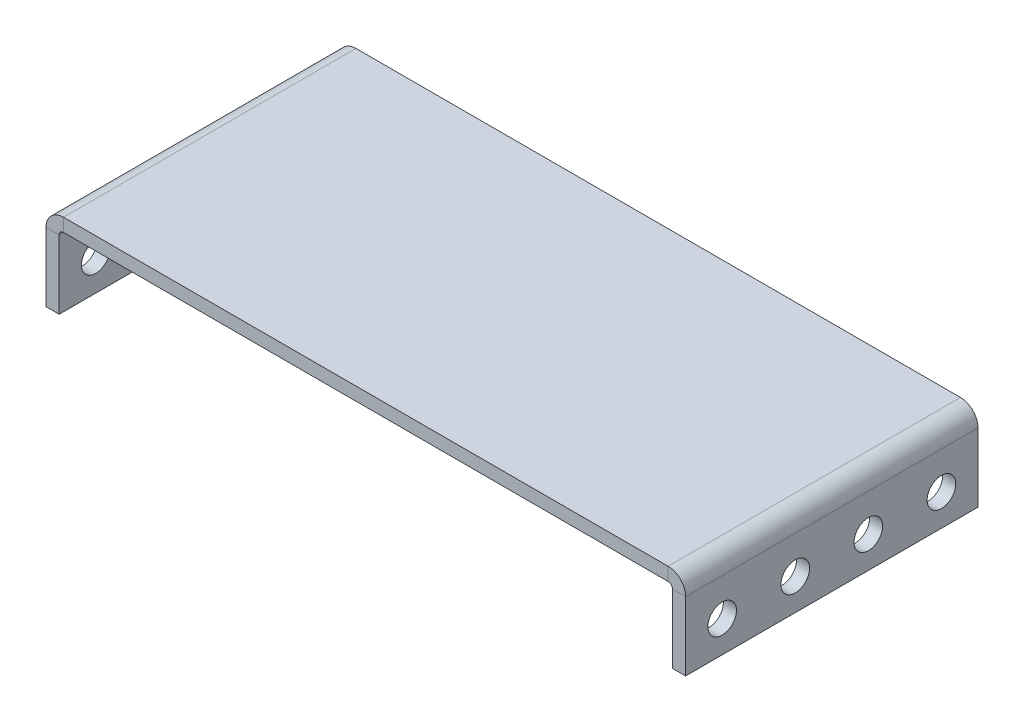
ISO-10303-21;
HEADER;
FILE_DESCRIPTION(('STEP AP214'),'2;1');
FILE_NAME('part.step','',(''),(''),'','','');
FILE_SCHEMA(('AUTOMOTIVE_DESIGN { 1 0 10303 214 1 1 1 1 }'));
ENDSEC;
DATA;
#1=APPLICATION_CONTEXT('core data for automotive mechanical design processes');
#2=APPLICATION_PROTOCOL_DEFINITION('international standard','automotive_design',2000,#1);
#3=PRODUCT_CONTEXT('',#1,'mechanical');
#4=PRODUCT('Part','Part','',(#3));
#5=PRODUCT_RELATED_PRODUCT_CATEGORY('part','',(#4));
#6=PRODUCT_DEFINITION_FORMATION('','',#4);
#7=PRODUCT_DEFINITION_CONTEXT('part definition',#1,'design');
#8=PRODUCT_DEFINITION('design','',#6,#7);
#9=PRODUCT_DEFINITION_SHAPE('','',#8);
#10=(LENGTH_UNIT() NAMED_UNIT(*) SI_UNIT(.MILLI.,.METRE.));
#11=(NAMED_UNIT(*) PLANE_ANGLE_UNIT() SI_UNIT($,.RADIAN.));
#12=(NAMED_UNIT(*) SI_UNIT($,.STERADIAN.) SOLID_ANGLE_UNIT());
#13=UNCERTAINTY_MEASURE_WITH_UNIT(LENGTH_MEASURE(1.E-05),#10,'distance_accuracy_value','');
#14=(GEOMETRIC_REPRESENTATION_CONTEXT(3) GLOBAL_UNCERTAINTY_ASSIGNED_CONTEXT((#13)) GLOBAL_UNIT_ASSIGNED_CONTEXT((#10,
#11,#12)) REPRESENTATION_CONTEXT('',''));
#15=CARTESIAN_POINT('',(0.,0.,0.));
#16=DIRECTION('',(0.,0.,1.));
#17=DIRECTION('',(1.,0.,0.));
#18=AXIS2_PLACEMENT_3D('',#15,#16,#17);
#19=CARTESIAN_POINT('',(52.5145,6.34999999999999,50.8));
#20=DIRECTION('',(0.,0.,1.));
#21=DIRECTION('',(1.,0.,0.));
#22=AXIS2_PLACEMENT_3D('',#19,#20,#21);
#23=PLANE('',#22);
#24=DIRECTION('',(0.,1.,0.));
#25=VECTOR('',#24,1.);
#26=CARTESIAN_POINT('',(52.5145,6.34999999999999,50.8));
#27=LINE('',#26,#25);
#28=CARTESIAN_POINT('',(52.5145,6.34999999999999,50.8));
#29=VERTEX_POINT('',#28);
#30=CARTESIAN_POINT('',(52.5145,8.63599999999999,50.8));
#31=VERTEX_POINT('',#30);
#32=EDGE_CURVE('E11',#29,#31,#27,.T.);
#33=ORIENTED_EDGE('',*,*,#32,.F.);
#34=CARTESIAN_POINT('',(52.5145,5.58799999999999,50.8));
#35=DIRECTION('',(0.,0.,-1.));
#36=DIRECTION('',(-1.,0.,0.));
#37=AXIS2_PLACEMENT_3D('',#34,#35,#36);
#38=CIRCLE('',#37,0.762);
#39=CARTESIAN_POINT('',(53.2765,5.58799999999999,50.8));
#40=VERTEX_POINT('',#39);
#41=EDGE_CURVE('E290',#40,#29,#38,.F.);
#42=ORIENTED_EDGE('',*,*,#41,.F.);
#43=DIRECTION('',(-1.,0.,0.));
#44=VECTOR('',#43,1.);
#45=CARTESIAN_POINT('',(55.5625,5.58799999999999,50.8));
#46=LINE('',#45,#44);
#47=CARTESIAN_POINT('',(55.5625,5.58799999999999,50.8));
#48=VERTEX_POINT('',#47);
#49=EDGE_CURVE('E53',#48,#40,#46,.T.);
#50=ORIENTED_EDGE('',*,*,#49,.F.);
#51=CARTESIAN_POINT('',(52.5145,5.58799999999999,50.8));
#52=DIRECTION('',(0.,0.,1.));
#53=DIRECTION('',(1.,0.,0.));
#54=AXIS2_PLACEMENT_3D('',#51,#52,#53);
#55=CIRCLE('',#54,3.048);
#56=EDGE_CURVE('E154',#48,#31,#55,.T.);
#57=ORIENTED_EDGE('',*,*,#56,.T.);
#58=EDGE_LOOP('',(#33,#42,#50,#57));
#59=FACE_BOUND('',#58,.T.);
#60=ADVANCED_FACE('F44',(#59),#23,.T.);
#61=CARTESIAN_POINT('',(55.5625,5.58799999999999,50.8));
#62=DIRECTION('',(0.,0.,1.));
#63=DIRECTION('',(1.,0.,0.));
#64=AXIS2_PLACEMENT_3D('',#61,#62,#63);
#65=PLANE('',#64);
#66=DIRECTION('',(-1.,0.,0.));
#67=VECTOR('',#66,1.);
#68=CARTESIAN_POINT('',(-53.2765,6.35,50.8));
#69=LINE('',#68,#67);
#70=CARTESIAN_POINT('',(-52.5145,6.35,50.8));
#71=VERTEX_POINT('',#70);
#72=EDGE_CURVE('E148',#29,#71,#69,.T.);
#73=ORIENTED_EDGE('',*,*,#72,.F.);
#74=ORIENTED_EDGE('',*,*,#32,.T.);
#75=DIRECTION('',(-1.,0.,0.));
#76=VECTOR('',#75,1.);
#77=CARTESIAN_POINT('',(-53.2765,8.636,50.8));
#78=LINE('',#77,#76);
#79=CARTESIAN_POINT('',(-52.5145,8.636,50.8));
#80=VERTEX_POINT('',#79);
#81=EDGE_CURVE('E145',#31,#80,#78,.T.);
#82=ORIENTED_EDGE('',*,*,#81,.T.);
#83=DIRECTION('',(0.,-1.,0.));
#84=VECTOR('',#83,1.);
#85=CARTESIAN_POINT('',(-52.5145,8.636,50.8));
#86=LINE('',#85,#84);
#87=EDGE_CURVE('E266',#80,#71,#86,.T.);
#88=ORIENTED_EDGE('',*,*,#87,.T.);
#89=EDGE_LOOP('',(#73,#74,#82,#88));
#90=FACE_BOUND('',#89,.T.);
#91=ADVANCED_FACE('F143',(#90),#65,.T.);
#92=CARTESIAN_POINT('',(53.2765,5.58799999999999,0.));
#93=DIRECTION('',(0.,0.,-1.));
#94=DIRECTION('',(-1.,0.,0.));
#95=AXIS2_PLACEMENT_3D('',#92,#93,#94);
#96=PLANE('',#95);
#97=DIRECTION('',(1.,0.,0.));
#98=VECTOR('',#97,1.);
#99=CARTESIAN_POINT('',(53.2765,5.58799999999999,0.));
#100=LINE('',#99,#98);
#101=CARTESIAN_POINT('',(53.2765,5.58799999999999,0.));
#102=VERTEX_POINT('',#101);
#103=CARTESIAN_POINT('',(55.5625,5.58799999999999,0.));
#104=VERTEX_POINT('',#103);
#105=EDGE_CURVE('E274',#102,#104,#100,.T.);
#106=ORIENTED_EDGE('',*,*,#105,.F.);
#107=CARTESIAN_POINT('',(52.5145,5.58799999999999,0.));
#108=DIRECTION('',(0.,0.,-1.));
#109=DIRECTION('',(-1.,0.,0.));
#110=AXIS2_PLACEMENT_3D('',#107,#108,#109);
#111=CIRCLE('',#110,0.762);
#112=CARTESIAN_POINT('',(52.5145,6.34999999999999,0.));
#113=VERTEX_POINT('',#112);
#114=EDGE_CURVE('E203',#102,#113,#111,.F.);
#115=ORIENTED_EDGE('',*,*,#114,.T.);
#116=DIRECTION('',(0.,-1.,0.));
#117=VECTOR('',#116,1.);
#118=CARTESIAN_POINT('',(52.5145,8.63599999999999,0.));
#119=LINE('',#118,#117);
#120=CARTESIAN_POINT('',(52.5145,8.63599999999999,0.));
#121=VERTEX_POINT('',#120);
#122=EDGE_CURVE('E271',#121,#113,#119,.T.);
#123=ORIENTED_EDGE('',*,*,#122,.F.);
#124=CARTESIAN_POINT('',(52.5145,5.58799999999999,0.));
#125=DIRECTION('',(0.,0.,1.));
#126=DIRECTION('',(1.,0.,0.));
#127=AXIS2_PLACEMENT_3D('',#124,#125,#126);
#128=CIRCLE('',#127,3.048);
#129=EDGE_CURVE('E167',#104,#121,#128,.T.);
#130=ORIENTED_EDGE('',*,*,#129,.F.);
#131=EDGE_LOOP('',(#106,#115,#123,#130));
#132=FACE_BOUND('',#131,.T.);
#133=ADVANCED_FACE('F400',(#132),#96,.T.);
#134=CARTESIAN_POINT('',(52.5145,8.63599999999999,0.));
#135=DIRECTION('',(0.,0.,-1.));
#136=DIRECTION('',(-1.,0.,0.));
#137=AXIS2_PLACEMENT_3D('',#134,#135,#136);
#138=PLANE('',#137);
#139=DIRECTION('',(0.,1.,0.));
#140=VECTOR('',#139,1.);
#141=CARTESIAN_POINT('',(53.2765,6.34999999999999,0.));
#142=LINE('',#141,#140);
#143=CARTESIAN_POINT('',(53.2765,-6.34999999999999,0.));
#144=VERTEX_POINT('',#143);
#145=EDGE_CURVE('E207',#144,#102,#142,.T.);
#146=ORIENTED_EDGE('',*,*,#145,.T.);
#147=ORIENTED_EDGE('',*,*,#105,.T.);
#148=DIRECTION('',(0.,1.,0.));
#149=VECTOR('',#148,1.);
#150=CARTESIAN_POINT('',(55.5625,6.34999999999999,0.));
#151=LINE('',#150,#149);
#152=CARTESIAN_POINT('',(55.5625,-6.34999999999999,0.));
#153=VERTEX_POINT('',#152);
#154=EDGE_CURVE('E215',#153,#104,#151,.T.);
#155=ORIENTED_EDGE('',*,*,#154,.F.);
#156=DIRECTION('',(-1.,0.,0.));
#157=VECTOR('',#156,1.);
#158=CARTESIAN_POINT('',(55.5625,-6.34999999999999,0.));
#159=LINE('',#158,#157);
#160=EDGE_CURVE('E211',#153,#144,#159,.T.);
#161=ORIENTED_EDGE('',*,*,#160,.T.);
#162=EDGE_LOOP('',(#146,#147,#155,#161));
#163=FACE_BOUND('',#162,.T.);
#164=ADVANCED_FACE('F445',(#163),#138,.T.);
#165=CARTESIAN_POINT('',(-53.2765,5.588,50.8));
#166=DIRECTION('',(0.,0.,1.));
#167=DIRECTION('',(1.,0.,0.));
#168=AXIS2_PLACEMENT_3D('',#165,#166,#167);
#169=PLANE('',#168);
#170=DIRECTION('',(-1.,0.,0.));
#171=VECTOR('',#170,1.);
#172=CARTESIAN_POINT('',(-53.2765,5.588,50.8));
#173=LINE('',#172,#171);
#174=CARTESIAN_POINT('',(-53.2765,5.588,50.8));
#175=VERTEX_POINT('',#174);
#176=CARTESIAN_POINT('',(-55.5625,5.588,50.8));
#177=VERTEX_POINT('',#176);
#178=EDGE_CURVE('E61',#175,#177,#173,.T.);
#179=ORIENTED_EDGE('',*,*,#178,.F.);
#180=CARTESIAN_POINT('',(-52.5145,5.588,50.8));
#181=DIRECTION('',(0.,0.,-1.));
#182=DIRECTION('',(-1.,0.,0.));
#183=AXIS2_PLACEMENT_3D('',#180,#181,#182);
#184=CIRCLE('',#183,0.762);
#185=EDGE_CURVE('E305',#71,#175,#184,.F.);
#186=ORIENTED_EDGE('',*,*,#185,.F.);
#187=ORIENTED_EDGE('',*,*,#87,.F.);
#188=CARTESIAN_POINT('',(-52.5145,5.588,50.8));
#189=DIRECTION('',(0.,0.,1.));
#190=DIRECTION('',(1.,0.,0.));
#191=AXIS2_PLACEMENT_3D('',#188,#189,#190);
#192=CIRCLE('',#191,3.048);
#193=EDGE_CURVE('E177',#80,#177,#192,.T.);
#194=ORIENTED_EDGE('',*,*,#193,.T.);
#195=EDGE_LOOP('',(#179,#186,#187,#194));
#196=FACE_BOUND('',#195,.T.);
#197=ADVANCED_FACE('F450',(#196),#169,.T.);
#198=CARTESIAN_POINT('',(-52.5145,8.636,50.8));
#199=DIRECTION('',(0.,0.,1.));
#200=DIRECTION('',(1.,0.,0.));
#201=AXIS2_PLACEMENT_3D('',#198,#199,#200);
#202=PLANE('',#201);
#203=DIRECTION('',(0.,-1.,0.));
#204=VECTOR('',#203,1.);
#205=CARTESIAN_POINT('',(-53.2765,6.35,50.8));
#206=LINE('',#205,#204);
#207=CARTESIAN_POINT('',(-53.2765,-6.35,50.8));
#208=VERTEX_POINT('',#207);
#209=EDGE_CURVE('E309',#175,#208,#206,.T.);
#210=ORIENTED_EDGE('',*,*,#209,.F.);
#211=ORIENTED_EDGE('',*,*,#178,.T.);
#212=DIRECTION('',(0.,1.,0.));
#213=VECTOR('',#212,1.);
#214=CARTESIAN_POINT('',(-55.5625,6.35,50.8));
#215=LINE('',#214,#213);
#216=CARTESIAN_POINT('',(-55.5625,-6.35,50.8));
#217=VERTEX_POINT('',#216);
#218=EDGE_CURVE('E115',#177,#217,#215,.F.);
#219=ORIENTED_EDGE('',*,*,#218,.T.);
#220=DIRECTION('',(-1.,0.,0.));
#221=VECTOR('',#220,1.);
#222=CARTESIAN_POINT('',(-53.2765,-6.35,50.8));
#223=LINE('',#222,#221);
#224=EDGE_CURVE('E313',#208,#217,#223,.T.);
#225=ORIENTED_EDGE('',*,*,#224,.F.);
#226=EDGE_LOOP('',(#210,#211,#219,#225));
#227=FACE_BOUND('',#226,.T.);
#228=ADVANCED_FACE('F424',(#227),#202,.T.);
#229=CARTESIAN_POINT('',(-52.5145,6.35,0.));
#230=DIRECTION('',(0.,0.,-1.));
#231=DIRECTION('',(-1.,0.,0.));
#232=AXIS2_PLACEMENT_3D('',#229,#230,#231);
#233=PLANE('',#232);
#234=DIRECTION('',(0.,1.,0.));
#235=VECTOR('',#234,1.);
#236=CARTESIAN_POINT('',(-52.5145,6.35,0.));
#237=LINE('',#236,#235);
#238=CARTESIAN_POINT('',(-52.5145,6.35,0.));
#239=VERTEX_POINT('',#238);
#240=CARTESIAN_POINT('',(-52.5145,8.636,0.));
#241=VERTEX_POINT('',#240);
#242=EDGE_CURVE('E102',#239,#241,#237,.T.);
#243=ORIENTED_EDGE('',*,*,#242,.F.);
#244=CARTESIAN_POINT('',(-52.5145,5.588,0.));
#245=DIRECTION('',(0.,0.,-1.));
#246=DIRECTION('',(-1.,0.,0.));
#247=AXIS2_PLACEMENT_3D('',#244,#245,#246);
#248=CIRCLE('',#247,0.762);
#249=CARTESIAN_POINT('',(-53.2765,5.588,0.));
#250=VERTEX_POINT('',#249);
#251=EDGE_CURVE('E197',#239,#250,#248,.F.);
#252=ORIENTED_EDGE('',*,*,#251,.T.);
#253=DIRECTION('',(1.,0.,0.));
#254=VECTOR('',#253,1.);
#255=CARTESIAN_POINT('',(-55.5625,5.588,0.));
#256=LINE('',#255,#254);
#257=CARTESIAN_POINT('',(-55.5625,5.588,0.));
#258=VERTEX_POINT('',#257);
#259=EDGE_CURVE('E109',#258,#250,#256,.T.);
#260=ORIENTED_EDGE('',*,*,#259,.F.);
#261=CARTESIAN_POINT('',(-52.5145,5.588,0.));
#262=DIRECTION('',(0.,0.,1.));
#263=DIRECTION('',(1.,0.,0.));
#264=AXIS2_PLACEMENT_3D('',#261,#262,#263);
#265=CIRCLE('',#264,3.048);
#266=EDGE_CURVE('E224',#241,#258,#265,.T.);
#267=ORIENTED_EDGE('',*,*,#266,.F.);
#268=EDGE_LOOP('',(#243,#252,#260,#267));
#269=FACE_BOUND('',#268,.T.);
#270=ADVANCED_FACE('F412',(#269),#233,.T.);
#271=CARTESIAN_POINT('',(-55.5625,5.588,0.));
#272=DIRECTION('',(0.,0.,-1.));
#273=DIRECTION('',(-1.,0.,0.));
#274=AXIS2_PLACEMENT_3D('',#271,#272,#273);
#275=PLANE('',#274);
#276=DIRECTION('',(-1.,0.,0.));
#277=VECTOR('',#276,1.);
#278=CARTESIAN_POINT('',(-53.2765,6.35,0.));
#279=LINE('',#278,#277);
#280=EDGE_CURVE('E200',#113,#239,#279,.T.);
#281=ORIENTED_EDGE('',*,*,#280,.T.);
#282=ORIENTED_EDGE('',*,*,#242,.T.);
#283=DIRECTION('',(-1.,0.,0.));
#284=VECTOR('',#283,1.);
#285=CARTESIAN_POINT('',(-53.2765,8.636,0.));
#286=LINE('',#285,#284);
#287=EDGE_CURVE('E221',#121,#241,#286,.T.);
#288=ORIENTED_EDGE('',*,*,#287,.F.);
#289=ORIENTED_EDGE('',*,*,#122,.T.);
#290=EDGE_LOOP('',(#281,#282,#288,#289));
#291=FACE_BOUND('',#290,.T.);
#292=ADVANCED_FACE('F401',(#291),#275,.T.);
#293=CARTESIAN_POINT('',(-55.5625,6.35,50.8));
#294=DIRECTION('',(1.,0.,0.));
#295=DIRECTION('',(0.,0.,-1.));
#296=AXIS2_PLACEMENT_3D('',#293,#294,#295);
#297=PLANE('',#296);
#298=CARTESIAN_POINT('',(-55.5625,-0.888959105999997,6.35));
#299=DIRECTION('',(1.,0.,0.));
#300=DIRECTION('',(0.,0.,-1.));
#301=AXIS2_PLACEMENT_3D('',#298,#299,#300);
#302=CIRCLE('',#301,2.4892);
#303=CARTESIAN_POINT('',(-55.5625,-0.888959105999997,3.8608));
#304=VERTEX_POINT('',#303);
#305=EDGE_CURVE('E350',#304,#304,#302,.T.);
#306=ORIENTED_EDGE('',*,*,#305,.T.);
#307=EDGE_LOOP('',(#306));
#308=FACE_BOUND('',#307,.T.);
#309=CARTESIAN_POINT('',(-55.5625,-0.888959105999997,19.05));
#310=DIRECTION('',(1.,0.,0.));
#311=DIRECTION('',(0.,0.,-1.));
#312=AXIS2_PLACEMENT_3D('',#309,#310,#311);
#313=CIRCLE('',#312,2.4892);
#314=CARTESIAN_POINT('',(-55.5625,-0.888959105999997,16.5608));
#315=VERTEX_POINT('',#314);
#316=EDGE_CURVE('E364',#315,#315,#313,.T.);
#317=ORIENTED_EDGE('',*,*,#316,.T.);
#318=EDGE_LOOP('',(#317));
#319=FACE_BOUND('',#318,.T.);
#320=CARTESIAN_POINT('',(-55.5625,-0.888959105999997,31.75));
#321=DIRECTION('',(1.,0.,0.));
#322=DIRECTION('',(0.,0.,-1.));
#323=AXIS2_PLACEMENT_3D('',#320,#321,#322);
#324=CIRCLE('',#323,2.4892);
#325=CARTESIAN_POINT('',(-55.5625,-0.888959105999997,29.2608));
#326=VERTEX_POINT('',#325);
#327=EDGE_CURVE('E355',#326,#326,#324,.T.);
#328=ORIENTED_EDGE('',*,*,#327,.T.);
#329=EDGE_LOOP('',(#328));
#330=FACE_BOUND('',#329,.T.);
#331=CARTESIAN_POINT('',(-55.5625,-0.888959105999997,44.45));
#332=DIRECTION('',(1.,0.,0.));
#333=DIRECTION('',(0.,0.,-1.));
#334=AXIS2_PLACEMENT_3D('',#331,#332,#333);
#335=CIRCLE('',#334,2.4892);
#336=CARTESIAN_POINT('',(-55.5625,-0.888959105999997,41.9608));
#337=VERTEX_POINT('',#336);
#338=EDGE_CURVE('E356',#337,#337,#335,.T.);
#339=ORIENTED_EDGE('',*,*,#338,.T.);
#340=EDGE_LOOP('',(#339));
#341=FACE_BOUND('',#340,.T.);
#342=DIRECTION('',(0.,1.,0.));
#343=VECTOR('',#342,1.);
#344=CARTESIAN_POINT('',(-55.5625,6.35,0.));
#345=LINE('',#344,#343);
#346=CARTESIAN_POINT('',(-55.5625,-6.35,0.));
#347=VERTEX_POINT('',#346);
#348=EDGE_CURVE('E184',#258,#347,#345,.F.);
#349=ORIENTED_EDGE('',*,*,#348,.T.);
#350=DIRECTION('',(0.,0.,-1.));
#351=VECTOR('',#350,1.);
#352=CARTESIAN_POINT('',(-55.5625,-6.35,50.8));
#353=LINE('',#352,#351);
#354=EDGE_CURVE('E259',#217,#347,#353,.T.);
#355=ORIENTED_EDGE('',*,*,#354,.F.);
#356=ORIENTED_EDGE('',*,*,#218,.F.);
#357=DIRECTION('',(0.,0.,-1.));
#358=VECTOR('',#357,1.);
#359=CARTESIAN_POINT('',(-55.5625,5.588,50.8));
#360=LINE('',#359,#358);
#361=EDGE_CURVE('E180',#177,#258,#360,.T.);
#362=ORIENTED_EDGE('',*,*,#361,.T.);
#363=EDGE_LOOP('',(#349,#355,#356,#362));
#364=FACE_BOUND('',#363,.T.);
#365=ADVANCED_FACE('F418',(#308,#319,#330,#341,#364),#297,.F.);
#366=CARTESIAN_POINT('',(-53.2765,-6.35,50.8));
#367=DIRECTION('',(0.,-1.,0.));
#368=DIRECTION('',(0.,0.,-1.));
#369=AXIS2_PLACEMENT_3D('',#366,#367,#368);
#370=PLANE('',#369);
#371=DIRECTION('',(-1.,0.,0.));
#372=VECTOR('',#371,1.);
#373=CARTESIAN_POINT('',(-53.2765,-6.35,0.));
#374=LINE('',#373,#372);
#375=CARTESIAN_POINT('',(-53.2765,-6.35,0.));
#376=VERTEX_POINT('',#375);
#377=EDGE_CURVE('E188',#376,#347,#374,.T.);
#378=ORIENTED_EDGE('',*,*,#377,.F.);
#379=DIRECTION('',(0.,0.,-1.));
#380=VECTOR('',#379,1.);
#381=CARTESIAN_POINT('',(-53.2765,-6.35,50.8));
#382=LINE('',#381,#380);
#383=EDGE_CURVE('E256',#208,#376,#382,.T.);
#384=ORIENTED_EDGE('',*,*,#383,.F.);
#385=ORIENTED_EDGE('',*,*,#224,.T.);
#386=ORIENTED_EDGE('',*,*,#354,.T.);
#387=EDGE_LOOP('',(#378,#384,#385,#386));
#388=FACE_BOUND('',#387,.T.);
#389=ADVANCED_FACE('F423',(#388),#370,.T.);
#390=CARTESIAN_POINT('',(-53.2765,6.35,50.8));
#391=DIRECTION('',(1.,0.,0.));
#392=DIRECTION('',(0.,0.,-1.));
#393=AXIS2_PLACEMENT_3D('',#390,#391,#392);
#394=PLANE('',#393);
#395=CARTESIAN_POINT('',(-53.2765,-0.888959105999997,6.35));
#396=DIRECTION('',(1.,0.,0.));
#397=DIRECTION('',(0.,0.,-1.));
#398=AXIS2_PLACEMENT_3D('',#395,#396,#397);
#399=CIRCLE('',#398,2.4892);
#400=CARTESIAN_POINT('',(-53.2765,-0.888959105999997,3.8608));
#401=VERTEX_POINT('',#400);
#402=EDGE_CURVE('E189',#401,#401,#399,.T.);
#403=ORIENTED_EDGE('',*,*,#402,.F.);
#404=EDGE_LOOP('',(#403));
#405=FACE_BOUND('',#404,.T.);
#406=CARTESIAN_POINT('',(-53.2765,-0.888959105999997,19.05));
#407=DIRECTION('',(1.,0.,0.));
#408=DIRECTION('',(0.,0.,-1.));
#409=AXIS2_PLACEMENT_3D('',#406,#407,#408);
#410=CIRCLE('',#409,2.4892);
#411=CARTESIAN_POINT('',(-53.2765,-0.888959105999997,16.5608));
#412=VERTEX_POINT('',#411);
#413=EDGE_CURVE('E326',#412,#412,#410,.T.);
#414=ORIENTED_EDGE('',*,*,#413,.F.);
#415=EDGE_LOOP('',(#414));
#416=FACE_BOUND('',#415,.T.);
#417=CARTESIAN_POINT('',(-53.2765,-0.888959105999997,31.75));
#418=DIRECTION('',(1.,0.,0.));
#419=DIRECTION('',(0.,0.,-1.));
#420=AXIS2_PLACEMENT_3D('',#417,#418,#419);
#421=CIRCLE('',#420,2.4892);
#422=CARTESIAN_POINT('',(-53.2765,-0.888959105999997,29.2608));
#423=VERTEX_POINT('',#422);
#424=EDGE_CURVE('E334',#423,#423,#421,.T.);
#425=ORIENTED_EDGE('',*,*,#424,.F.);
#426=EDGE_LOOP('',(#425));
#427=FACE_BOUND('',#426,.T.);
#428=CARTESIAN_POINT('',(-53.2765,-0.888959105999997,44.45));
#429=DIRECTION('',(1.,0.,0.));
#430=DIRECTION('',(0.,0.,-1.));
#431=AXIS2_PLACEMENT_3D('',#428,#429,#430);
#432=CIRCLE('',#431,2.4892);
#433=CARTESIAN_POINT('',(-53.2765,-0.888959105999997,41.9608));
#434=VERTEX_POINT('',#433);
#435=EDGE_CURVE('E342',#434,#434,#432,.T.);
#436=ORIENTED_EDGE('',*,*,#435,.F.);
#437=EDGE_LOOP('',(#436));
#438=FACE_BOUND('',#437,.T.);
#439=DIRECTION('',(0.,-1.,0.));
#440=VECTOR('',#439,1.);
#441=CARTESIAN_POINT('',(-53.2765,6.35,0.));
#442=LINE('',#441,#440);
#443=EDGE_CURVE('E193',#250,#376,#442,.T.);
#444=ORIENTED_EDGE('',*,*,#443,.F.);
#445=DIRECTION('',(0.,0.,-1.));
#446=VECTOR('',#445,1.);
#447=CARTESIAN_POINT('',(-53.2765,5.588,50.8));
#448=LINE('',#447,#446);
#449=EDGE_CURVE('E252',#175,#250,#448,.T.);
#450=ORIENTED_EDGE('',*,*,#449,.F.);
#451=ORIENTED_EDGE('',*,*,#209,.T.);
#452=ORIENTED_EDGE('',*,*,#383,.T.);
#453=EDGE_LOOP('',(#444,#450,#451,#452));
#454=FACE_BOUND('',#453,.T.);
#455=ADVANCED_FACE('F426',(#405,#416,#427,#438,#454),#394,.T.);
#456=CARTESIAN_POINT('',(-52.5145,5.588,50.8));
#457=DIRECTION('',(0.,0.,-1.));
#458=DIRECTION('',(-1.,0.,0.));
#459=AXIS2_PLACEMENT_3D('',#456,#457,#458);
#460=CYLINDRICAL_SURFACE('',#459,0.762);
#461=ORIENTED_EDGE('',*,*,#251,.F.);
#462=DIRECTION('',(0.,0.,-1.));
#463=VECTOR('',#462,1.);
#464=CARTESIAN_POINT('',(-52.5145,6.35,50.8));
#465=LINE('',#464,#463);
#466=EDGE_CURVE('E248',#71,#239,#465,.T.);
#467=ORIENTED_EDGE('',*,*,#466,.F.);
#468=ORIENTED_EDGE('',*,*,#185,.T.);
#469=ORIENTED_EDGE('',*,*,#449,.T.);
#470=EDGE_LOOP('',(#461,#467,#468,#469));
#471=FACE_BOUND('',#470,.T.);
#472=ADVANCED_FACE('F409',(#471),#460,.F.);
#473=CARTESIAN_POINT('',(-53.2765,6.35,50.8));
#474=DIRECTION('',(0.,-1.,0.));
#475=DIRECTION('',(1.,0.,0.));
#476=AXIS2_PLACEMENT_3D('',#473,#474,#475);
#477=PLANE('',#476);
#478=ORIENTED_EDGE('',*,*,#280,.F.);
#479=DIRECTION('',(0.,0.,-1.));
#480=VECTOR('',#479,1.);
#481=CARTESIAN_POINT('',(52.5145,6.34999999999999,50.8));
#482=LINE('',#481,#480);
#483=EDGE_CURVE('E244',#29,#113,#482,.T.);
#484=ORIENTED_EDGE('',*,*,#483,.F.);
#485=ORIENTED_EDGE('',*,*,#72,.T.);
#486=ORIENTED_EDGE('',*,*,#466,.T.);
#487=EDGE_LOOP('',(#478,#484,#485,#486));
#488=FACE_BOUND('',#487,.T.);
#489=ADVANCED_FACE('F404',(#488),#477,.T.);
#490=CARTESIAN_POINT('',(52.5145,5.58799999999999,50.8));
#491=DIRECTION('',(0.,0.,-1.));
#492=DIRECTION('',(-1.,0.,0.));
#493=AXIS2_PLACEMENT_3D('',#490,#491,#492);
#494=CYLINDRICAL_SURFACE('',#493,0.762);
#495=ORIENTED_EDGE('',*,*,#114,.F.);
#496=DIRECTION('',(0.,0.,-1.));
#497=VECTOR('',#496,1.);
#498=CARTESIAN_POINT('',(53.2765,5.58799999999999,50.8));
#499=LINE('',#498,#497);
#500=EDGE_CURVE('E240',#40,#102,#499,.T.);
#501=ORIENTED_EDGE('',*,*,#500,.F.);
#502=ORIENTED_EDGE('',*,*,#41,.T.);
#503=ORIENTED_EDGE('',*,*,#483,.T.);
#504=EDGE_LOOP('',(#495,#501,#502,#503));
#505=FACE_BOUND('',#504,.T.);
#506=ADVANCED_FACE('F289',(#505),#494,.F.);
#507=CARTESIAN_POINT('',(53.2765,6.34999999999999,50.8));
#508=DIRECTION('',(-1.,0.,0.));
#509=DIRECTION('',(0.,0.,1.));
#510=AXIS2_PLACEMENT_3D('',#507,#508,#509);
#511=PLANE('',#510);
#512=CARTESIAN_POINT('',(53.2765,-0.888959105999997,6.35));
#513=DIRECTION('',(-1.,0.,0.));
#514=DIRECTION('',(0.,0.,1.));
#515=AXIS2_PLACEMENT_3D('',#512,#513,#514);
#516=CIRCLE('',#515,2.4892);
#517=CARTESIAN_POINT('',(53.2765,-0.888959105999997,8.8392));
#518=VERTEX_POINT('',#517);
#519=EDGE_CURVE('E322',#518,#518,#516,.T.);
#520=ORIENTED_EDGE('',*,*,#519,.F.);
#521=EDGE_LOOP('',(#520));
#522=FACE_BOUND('',#521,.T.);
#523=CARTESIAN_POINT('',(53.2765,-0.888959105999997,19.05));
#524=DIRECTION('',(-1.,0.,0.));
#525=DIRECTION('',(0.,0.,1.));
#526=AXIS2_PLACEMENT_3D('',#523,#524,#525);
#527=CIRCLE('',#526,2.4892);
#528=CARTESIAN_POINT('',(53.2765,-0.888959105999997,21.5392));
#529=VERTEX_POINT('',#528);
#530=EDGE_CURVE('E330',#529,#529,#527,.T.);
#531=ORIENTED_EDGE('',*,*,#530,.F.);
#532=EDGE_LOOP('',(#531));
#533=FACE_BOUND('',#532,.T.);
#534=CARTESIAN_POINT('',(53.2765,-0.888959105999997,31.75));
#535=DIRECTION('',(-1.,0.,0.));
#536=DIRECTION('',(0.,0.,1.));
#537=AXIS2_PLACEMENT_3D('',#534,#535,#536);
#538=CIRCLE('',#537,2.4892);
#539=CARTESIAN_POINT('',(53.2765,-0.888959105999997,34.2392));
#540=VERTEX_POINT('',#539);
#541=EDGE_CURVE('E338',#540,#540,#538,.T.);
#542=ORIENTED_EDGE('',*,*,#541,.F.);
#543=EDGE_LOOP('',(#542));
#544=FACE_BOUND('',#543,.T.);
#545=CARTESIAN_POINT('',(53.2765,-0.888959105999997,44.45));
#546=DIRECTION('',(-1.,0.,0.));
#547=DIRECTION('',(0.,0.,1.));
#548=AXIS2_PLACEMENT_3D('',#545,#546,#547);
#549=CIRCLE('',#548,2.4892);
#550=CARTESIAN_POINT('',(53.2765,-0.888959105999997,46.9392));
#551=VERTEX_POINT('',#550);
#552=EDGE_CURVE('E346',#551,#551,#549,.T.);
#553=ORIENTED_EDGE('',*,*,#552,.F.);
#554=EDGE_LOOP('',(#553));
#555=FACE_BOUND('',#554,.T.);
#556=ORIENTED_EDGE('',*,*,#145,.F.);
#557=DIRECTION('',(0.,0.,-1.));
#558=VECTOR('',#557,1.);
#559=CARTESIAN_POINT('',(53.2765,-6.34999999999999,50.8));
#560=LINE('',#559,#558);
#561=CARTESIAN_POINT('',(53.2765,-6.34999999999999,50.8));
#562=VERTEX_POINT('',#561);
#563=EDGE_CURVE('E237',#562,#144,#560,.T.);
#564=ORIENTED_EDGE('',*,*,#563,.F.);
#565=DIRECTION('',(0.,1.,0.));
#566=VECTOR('',#565,1.);
#567=CARTESIAN_POINT('',(53.2765,6.34999999999999,50.8));
#568=LINE('',#567,#566);
#569=EDGE_CURVE('E283',#562,#40,#568,.T.);
#570=ORIENTED_EDGE('',*,*,#569,.T.);
#571=ORIENTED_EDGE('',*,*,#500,.T.);
#572=EDGE_LOOP('',(#556,#564,#570,#571));
#573=FACE_BOUND('',#572,.T.);
#574=ADVANCED_FACE('F295',(#522,#533,#544,#555,#573),#511,.T.);
#575=CARTESIAN_POINT('',(55.5625,-6.34999999999999,50.8));
#576=DIRECTION('',(0.,-1.,0.));
#577=DIRECTION('',(0.,0.,-1.));
#578=AXIS2_PLACEMENT_3D('',#575,#576,#577);
#579=PLANE('',#578);
#580=ORIENTED_EDGE('',*,*,#160,.F.);
#581=DIRECTION('',(0.,0.,-1.));
#582=VECTOR('',#581,1.);
#583=CARTESIAN_POINT('',(55.5625,-6.34999999999999,50.8));
#584=LINE('',#583,#582);
#585=CARTESIAN_POINT('',(55.5625,-6.34999999999999,50.8));
#586=VERTEX_POINT('',#585);
#587=EDGE_CURVE('E234',#586,#153,#584,.T.);
#588=ORIENTED_EDGE('',*,*,#587,.F.);
#589=DIRECTION('',(-1.,0.,0.));
#590=VECTOR('',#589,1.);
#591=CARTESIAN_POINT('',(55.5625,-6.34999999999999,50.8));
#592=LINE('',#591,#590);
#593=EDGE_CURVE('E297',#586,#562,#592,.T.);
#594=ORIENTED_EDGE('',*,*,#593,.T.);
#595=ORIENTED_EDGE('',*,*,#563,.T.);
#596=EDGE_LOOP('',(#580,#588,#594,#595));
#597=FACE_BOUND('',#596,.T.);
#598=ADVANCED_FACE('F388',(#597),#579,.T.);
#599=CARTESIAN_POINT('',(55.5625,6.34999999999999,50.8));
#600=DIRECTION('',(-1.,0.,0.));
#601=DIRECTION('',(0.,0.,1.));
#602=AXIS2_PLACEMENT_3D('',#599,#600,#601);
#603=PLANE('',#602);
#604=CARTESIAN_POINT('',(55.5625,-0.888959105999997,6.35));
#605=DIRECTION('',(1.,0.,0.));
#606=DIRECTION('',(0.,0.,-1.));
#607=AXIS2_PLACEMENT_3D('',#604,#605,#606);
#608=CIRCLE('',#607,2.4892);
#609=CARTESIAN_POINT('',(55.5625,-0.888959105999997,3.8608));
#610=VERTEX_POINT('',#609);
#611=EDGE_CURVE('E372',#610,#610,#608,.T.);
#612=ORIENTED_EDGE('',*,*,#611,.F.);
#613=EDGE_LOOP('',(#612));
#614=FACE_BOUND('',#613,.T.);
#615=CARTESIAN_POINT('',(55.5625,-0.888959105999997,19.05));
#616=DIRECTION('',(1.,0.,0.));
#617=DIRECTION('',(0.,0.,-1.));
#618=AXIS2_PLACEMENT_3D('',#615,#616,#617);
#619=CIRCLE('',#618,2.4892);
#620=CARTESIAN_POINT('',(55.5625,-0.888959105999997,16.5608));
#621=VERTEX_POINT('',#620);
#622=EDGE_CURVE('E368',#621,#621,#619,.T.);
#623=ORIENTED_EDGE('',*,*,#622,.F.);
#624=EDGE_LOOP('',(#623));
#625=FACE_BOUND('',#624,.T.);
#626=CARTESIAN_POINT('',(55.5625,-0.888959105999997,31.75));
#627=DIRECTION('',(1.,0.,0.));
#628=DIRECTION('',(0.,0.,-1.));
#629=AXIS2_PLACEMENT_3D('',#626,#627,#628);
#630=CIRCLE('',#629,2.4892);
#631=CARTESIAN_POINT('',(55.5625,-0.888959105999997,29.2608));
#632=VERTEX_POINT('',#631);
#633=EDGE_CURVE('E360',#632,#632,#630,.T.);
#634=ORIENTED_EDGE('',*,*,#633,.F.);
#635=EDGE_LOOP('',(#634));
#636=FACE_BOUND('',#635,.T.);
#637=CARTESIAN_POINT('',(55.5625,-0.888959105999997,44.45));
#638=DIRECTION('',(1.,0.,0.));
#639=DIRECTION('',(0.,0.,-1.));
#640=AXIS2_PLACEMENT_3D('',#637,#638,#639);
#641=CIRCLE('',#640,2.4892);
#642=CARTESIAN_POINT('',(55.5625,-0.888959105999997,41.9608));
#643=VERTEX_POINT('',#642);
#644=EDGE_CURVE('E351',#643,#643,#641,.T.);
#645=ORIENTED_EDGE('',*,*,#644,.F.);
#646=EDGE_LOOP('',(#645));
#647=FACE_BOUND('',#646,.T.);
#648=ORIENTED_EDGE('',*,*,#154,.T.);
#649=DIRECTION('',(0.,0.,-1.));
#650=VECTOR('',#649,1.);
#651=CARTESIAN_POINT('',(55.5625,5.58799999999999,50.8));
#652=LINE('',#651,#650);
#653=EDGE_CURVE('E170',#48,#104,#652,.T.);
#654=ORIENTED_EDGE('',*,*,#653,.F.);
#655=DIRECTION('',(0.,1.,0.));
#656=VECTOR('',#655,1.);
#657=CARTESIAN_POINT('',(55.5625,6.34999999999999,50.8));
#658=LINE('',#657,#656);
#659=EDGE_CURVE('E160',#586,#48,#658,.T.);
#660=ORIENTED_EDGE('',*,*,#659,.F.);
#661=ORIENTED_EDGE('',*,*,#587,.T.);
#662=EDGE_LOOP('',(#648,#654,#660,#661));
#663=FACE_BOUND('',#662,.T.);
#664=ADVANCED_FACE('F385',(#614,#625,#636,#647,#663),#603,.F.);
#665=CARTESIAN_POINT('',(52.5145,5.58799999999999,50.8));
#666=DIRECTION('',(0.,0.,-1.));
#667=DIRECTION('',(-1.,0.,0.));
#668=AXIS2_PLACEMENT_3D('',#665,#666,#667);
#669=CYLINDRICAL_SURFACE('',#668,3.048);
#670=ORIENTED_EDGE('',*,*,#129,.T.);
#671=DIRECTION('',(0.,0.,-1.));
#672=VECTOR('',#671,1.);
#673=CARTESIAN_POINT('',(52.5145,8.63599999999999,50.8));
#674=LINE('',#673,#672);
#675=EDGE_CURVE('E164',#31,#121,#674,.T.);
#676=ORIENTED_EDGE('',*,*,#675,.F.);
#677=ORIENTED_EDGE('',*,*,#56,.F.);
#678=ORIENTED_EDGE('',*,*,#653,.T.);
#679=EDGE_LOOP('',(#670,#676,#677,#678));
#680=FACE_BOUND('',#679,.T.);
#681=ADVANCED_FACE('F165',(#680),#669,.T.);
#682=CARTESIAN_POINT('',(-53.2765,8.636,50.8));
#683=DIRECTION('',(0.,-1.,0.));
#684=DIRECTION('',(1.,0.,0.));
#685=AXIS2_PLACEMENT_3D('',#682,#683,#684);
#686=PLANE('',#685);
#687=ORIENTED_EDGE('',*,*,#287,.T.);
#688=DIRECTION('',(0.,0.,-1.));
#689=VECTOR('',#688,1.);
#690=CARTESIAN_POINT('',(-52.5145,8.636,50.8));
#691=LINE('',#690,#689);
#692=EDGE_CURVE('E171',#80,#241,#691,.T.);
#693=ORIENTED_EDGE('',*,*,#692,.F.);
#694=ORIENTED_EDGE('',*,*,#81,.F.);
#695=ORIENTED_EDGE('',*,*,#675,.T.);
#696=EDGE_LOOP('',(#687,#693,#694,#695));
#697=FACE_BOUND('',#696,.T.);
#698=ADVANCED_FACE('F173',(#697),#686,.F.);
#699=CARTESIAN_POINT('',(-52.5145,5.588,50.8));
#700=DIRECTION('',(0.,0.,-1.));
#701=DIRECTION('',(-1.,0.,0.));
#702=AXIS2_PLACEMENT_3D('',#699,#700,#701);
#703=CYLINDRICAL_SURFACE('',#702,3.048);
#704=ORIENTED_EDGE('',*,*,#266,.T.);
#705=ORIENTED_EDGE('',*,*,#361,.F.);
#706=ORIENTED_EDGE('',*,*,#193,.F.);
#707=ORIENTED_EDGE('',*,*,#692,.T.);
#708=EDGE_LOOP('',(#704,#705,#706,#707));
#709=FACE_BOUND('',#708,.T.);
#710=ADVANCED_FACE('F415',(#709),#703,.T.);
#711=CARTESIAN_POINT('',(-52.5145,5.588,50.8));
#712=DIRECTION('',(0.,0.,-1.));
#713=DIRECTION('',(-1.,0.,0.));
#714=AXIS2_PLACEMENT_3D('',#711,#712,#713);
#715=PLANE('',#714);
#716=ORIENTED_EDGE('',*,*,#659,.T.);
#717=ORIENTED_EDGE('',*,*,#49,.T.);
#718=ORIENTED_EDGE('',*,*,#569,.F.);
#719=ORIENTED_EDGE('',*,*,#593,.F.);
#720=EDGE_LOOP('',(#716,#717,#718,#719));
#721=FACE_BOUND('',#720,.T.);
#722=ADVANCED_FACE('F280',(#721),#715,.F.);
#723=CARTESIAN_POINT('',(-52.5145,5.588,0.));
#724=DIRECTION('',(0.,0.,-1.));
#725=DIRECTION('',(-1.,0.,0.));
#726=AXIS2_PLACEMENT_3D('',#723,#724,#725);
#727=PLANE('',#726);
#728=ORIENTED_EDGE('',*,*,#348,.F.);
#729=ORIENTED_EDGE('',*,*,#259,.T.);
#730=ORIENTED_EDGE('',*,*,#443,.T.);
#731=ORIENTED_EDGE('',*,*,#377,.T.);
#732=EDGE_LOOP('',(#728,#729,#730,#731));
#733=FACE_BOUND('',#732,.T.);
#734=ADVANCED_FACE('F420',(#733),#727,.T.);
#735=CARTESIAN_POINT('',(-55.5625,-0.888959105999997,44.45));
#736=DIRECTION('',(1.,0.,0.));
#737=DIRECTION('',(0.,0.,-1.));
#738=AXIS2_PLACEMENT_3D('',#735,#736,#737);
#739=CYLINDRICAL_SURFACE('',#738,2.4892);
#740=ORIENTED_EDGE('',*,*,#552,.T.);
#741=EDGE_LOOP('',(#740));
#742=FACE_BOUND('',#741,.T.);
#743=ORIENTED_EDGE('',*,*,#644,.T.);
#744=EDGE_LOOP('',(#743));
#745=FACE_BOUND('',#744,.T.);
#746=ADVANCED_FACE('F477',(#742,#745),#739,.F.);
#747=CARTESIAN_POINT('',(-55.5625,-0.888959105999997,31.75));
#748=DIRECTION('',(1.,0.,0.));
#749=DIRECTION('',(0.,0.,-1.));
#750=AXIS2_PLACEMENT_3D('',#747,#748,#749);
#751=CYLINDRICAL_SURFACE('',#750,2.4892);
#752=ORIENTED_EDGE('',*,*,#541,.T.);
#753=EDGE_LOOP('',(#752));
#754=FACE_BOUND('',#753,.T.);
#755=ORIENTED_EDGE('',*,*,#633,.T.);
#756=EDGE_LOOP('',(#755));
#757=FACE_BOUND('',#756,.T.);
#758=ADVANCED_FACE('F485',(#754,#757),#751,.F.);
#759=CARTESIAN_POINT('',(-55.5625,-0.888959105999997,19.05));
#760=DIRECTION('',(1.,0.,0.));
#761=DIRECTION('',(0.,0.,-1.));
#762=AXIS2_PLACEMENT_3D('',#759,#760,#761);
#763=CYLINDRICAL_SURFACE('',#762,2.4892);
#764=ORIENTED_EDGE('',*,*,#530,.T.);
#765=EDGE_LOOP('',(#764));
#766=FACE_BOUND('',#765,.T.);
#767=ORIENTED_EDGE('',*,*,#622,.T.);
#768=EDGE_LOOP('',(#767));
#769=FACE_BOUND('',#768,.T.);
#770=ADVANCED_FACE('F486',(#766,#769),#763,.F.);
#771=CARTESIAN_POINT('',(-55.5625,-0.888959105999997,6.35));
#772=DIRECTION('',(1.,0.,0.));
#773=DIRECTION('',(0.,0.,-1.));
#774=AXIS2_PLACEMENT_3D('',#771,#772,#773);
#775=CYLINDRICAL_SURFACE('',#774,2.4892);
#776=ORIENTED_EDGE('',*,*,#519,.T.);
#777=EDGE_LOOP('',(#776));
#778=FACE_BOUND('',#777,.T.);
#779=ORIENTED_EDGE('',*,*,#611,.T.);
#780=EDGE_LOOP('',(#779));
#781=FACE_BOUND('',#780,.T.);
#782=ADVANCED_FACE('F383',(#778,#781),#775,.F.);
#783=ORIENTED_EDGE('',*,*,#435,.T.);
#784=EDGE_LOOP('',(#783));
#785=FACE_BOUND('',#784,.T.);
#786=ORIENTED_EDGE('',*,*,#338,.F.);
#787=EDGE_LOOP('',(#786));
#788=FACE_BOUND('',#787,.T.);
#789=ADVANCED_FACE('F472',(#785,#788),#739,.F.);
#790=ORIENTED_EDGE('',*,*,#424,.T.);
#791=EDGE_LOOP('',(#790));
#792=FACE_BOUND('',#791,.T.);
#793=ORIENTED_EDGE('',*,*,#327,.F.);
#794=EDGE_LOOP('',(#793));
#795=FACE_BOUND('',#794,.T.);
#796=ADVANCED_FACE('F474',(#792,#795),#751,.F.);
#797=ORIENTED_EDGE('',*,*,#413,.T.);
#798=EDGE_LOOP('',(#797));
#799=FACE_BOUND('',#798,.T.);
#800=ORIENTED_EDGE('',*,*,#316,.F.);
#801=EDGE_LOOP('',(#800));
#802=FACE_BOUND('',#801,.T.);
#803=ADVANCED_FACE('F482',(#799,#802),#763,.F.);
#804=ORIENTED_EDGE('',*,*,#402,.T.);
#805=EDGE_LOOP('',(#804));
#806=FACE_BOUND('',#805,.T.);
#807=ORIENTED_EDGE('',*,*,#305,.F.);
#808=EDGE_LOOP('',(#807));
#809=FACE_BOUND('',#808,.T.);
#810=ADVANCED_FACE('F489',(#806,#809),#775,.F.);
#811=CLOSED_SHELL('',(#60,#91,#133,#164,#197,#228,#270,#292,#365,#389,#455,#472,#489,#506,#574,
#598,#664,#681,#698,#710,#722,#734,#746,#758,#770,#782,#789,#796,#803,#810));
#812=MANIFOLD_SOLID_BREP('B2',#811);
#813=ADVANCED_BREP_SHAPE_REPRESENTATION('',(#18,#812),#14);
#814=SHAPE_DEFINITION_REPRESENTATION(#9,#813);
ENDSEC;
END-ISO-10303-21;
